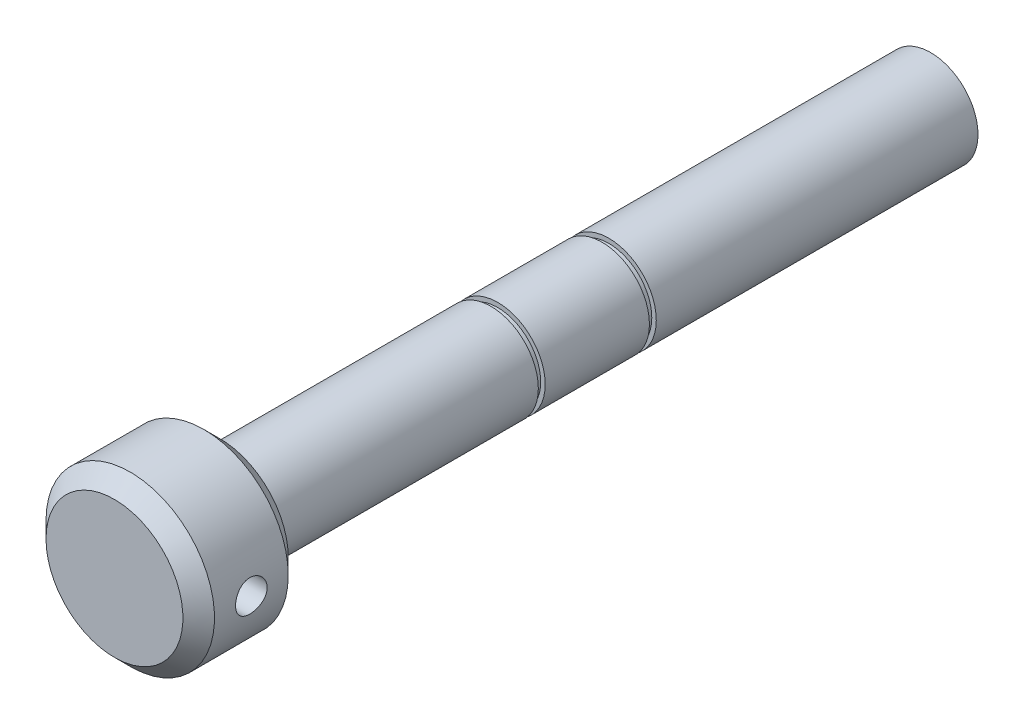
ISO-10303-21;
HEADER;
FILE_DESCRIPTION(('STEP AP214'),'2;1');
FILE_NAME('part.step','',(''),(''),'','','');
FILE_SCHEMA(('AUTOMOTIVE_DESIGN { 1 0 10303 214 1 1 1 1 }'));
ENDSEC;
DATA;
#1=APPLICATION_CONTEXT('core data for automotive mechanical design processes');
#2=APPLICATION_PROTOCOL_DEFINITION('international standard','automotive_design',2000,#1);
#3=PRODUCT_CONTEXT('',#1,'mechanical');
#4=PRODUCT('Part','Part','',(#3));
#5=PRODUCT_RELATED_PRODUCT_CATEGORY('part','',(#4));
#6=PRODUCT_DEFINITION_FORMATION('','',#4);
#7=PRODUCT_DEFINITION_CONTEXT('part definition',#1,'design');
#8=PRODUCT_DEFINITION('design','',#6,#7);
#9=PRODUCT_DEFINITION_SHAPE('','',#8);
#10=(LENGTH_UNIT() NAMED_UNIT(*) SI_UNIT(.MILLI.,.METRE.));
#11=(NAMED_UNIT(*) PLANE_ANGLE_UNIT() SI_UNIT($,.RADIAN.));
#12=(NAMED_UNIT(*) SI_UNIT($,.STERADIAN.) SOLID_ANGLE_UNIT());
#13=UNCERTAINTY_MEASURE_WITH_UNIT(LENGTH_MEASURE(1.E-05),#10,'distance_accuracy_value','');
#14=(GEOMETRIC_REPRESENTATION_CONTEXT(3) GLOBAL_UNCERTAINTY_ASSIGNED_CONTEXT((#13)) GLOBAL_UNIT_ASSIGNED_CONTEXT((#10,
#11,#12)) REPRESENTATION_CONTEXT('',''));
#15=CARTESIAN_POINT('',(0.,0.,0.));
#16=DIRECTION('',(0.,0.,1.));
#17=DIRECTION('',(1.,0.,0.));
#18=AXIS2_PLACEMENT_3D('',#15,#16,#17);
#19=CARTESIAN_POINT('',(0.,0.,-135.));
#20=DIRECTION('',(0.,0.,1.));
#21=DIRECTION('',(1.,0.,0.));
#22=AXIS2_PLACEMENT_3D('',#19,#20,#21);
#23=CYLINDRICAL_SURFACE('',#22,9.);
#24=CARTESIAN_POINT('',(0.,0.,0.));
#25=DIRECTION('',(0.,0.,1.));
#26=DIRECTION('',(1.,0.,0.));
#27=AXIS2_PLACEMENT_3D('',#24,#25,#26);
#28=CIRCLE('',#27,9.);
#29=CARTESIAN_POINT('',(9.,0.,0.));
#30=VERTEX_POINT('',#29);
#31=EDGE_CURVE('E149',#30,#30,#28,.T.);
#32=ORIENTED_EDGE('',*,*,#31,.F.);
#33=EDGE_LOOP('',(#32));
#34=FACE_BOUND('',#33,.T.);
#35=CARTESIAN_POINT('',(0.,0.,-51.5));
#36=DIRECTION('',(0.,0.,1.));
#37=DIRECTION('',(1.,0.,0.));
#38=AXIS2_PLACEMENT_3D('',#35,#36,#37);
#39=CIRCLE('',#38,9.);
#40=CARTESIAN_POINT('',(9.,0.,-51.5));
#41=VERTEX_POINT('',#40);
#42=EDGE_CURVE('E135',#41,#41,#39,.T.);
#43=ORIENTED_EDGE('',*,*,#42,.T.);
#44=EDGE_LOOP('',(#43));
#45=FACE_BOUND('',#44,.T.);
#46=ADVANCED_FACE('F43',(#34,#45),#23,.T.);
#47=CARTESIAN_POINT('',(0.,0.,20.));
#48=DIRECTION('',(0.,0.,-1.));
#49=DIRECTION('',(-1.,0.,0.));
#50=AXIS2_PLACEMENT_3D('',#47,#48,#49);
#51=CYLINDRICAL_SURFACE('',#50,16.);
#52=CARTESIAN_POINT('',(-16.,0.,7.));
#53=CARTESIAN_POINT('',(-15.999996976677,0.166943492930942,7.00000637917655));
#54=CARTESIAN_POINT('',(-15.9973601984343,0.333969985460197,7.01398215323876));
#55=CARTESIAN_POINT('',(-15.9870957178104,0.663316259683595,7.06947999023669));
#56=CARTESIAN_POINT('',(-15.9794638033379,0.825631948304451,7.11102530127947));
#57=CARTESIAN_POINT('',(-15.9600627753092,1.1407459237036,7.22034540251868));
#58=CARTESIAN_POINT('',(-15.9482973989297,1.29355266137069,7.28809650490509));
#59=CARTESIAN_POINT('',(-15.9219142119957,1.58561594618801,7.44783775384563));
#60=CARTESIAN_POINT('',(-15.9072966323658,1.72487358895465,7.53982593828964));
#61=CARTESIAN_POINT('',(-15.8766267286101,1.98756743186101,7.74659953600735));
#62=CARTESIAN_POINT('',(-15.860560697127,2.11081791006366,7.86161888934027));
#63=CARTESIAN_POINT('',(-15.828906369173,2.33639212270739,8.11068661817512));
#64=CARTESIAN_POINT('',(-15.8133181070905,2.43871435378483,8.24473635953857));
#65=CARTESIAN_POINT('',(-15.7842510249001,2.62029997331586,8.52937217672794));
#66=CARTESIAN_POINT('',(-15.7707898777236,2.69937443939211,8.68008074063447));
#67=CARTESIAN_POINT('',(-15.7476942642397,2.83101048664566,8.99293783035358));
#68=CARTESIAN_POINT('',(-15.7380594679392,2.88357435426196,9.15508536822243));
#69=CARTESIAN_POINT('',(-15.723845391491,2.96010107007,9.48423046182882));
#70=CARTESIAN_POINT('',(-15.7192089073281,2.98438780384078,9.65115019440693));
#71=CARTESIAN_POINT('',(-15.7153439430552,3.00467616190693,9.98675476961649));
#72=CARTESIAN_POINT('',(-15.7161149779752,3.00068032270748,10.1554394526046));
#73=CARTESIAN_POINT('',(-15.7229258540351,2.96477959204725,10.4874390505321));
#74=CARTESIAN_POINT('',(-15.7288961629467,2.9332429999209,10.6507954286003));
#75=CARTESIAN_POINT('',(-15.7453236656933,2.84373598792414,10.9698568395652));
#76=CARTESIAN_POINT('',(-15.7557810501903,2.78576444478999,11.1255615470186));
#77=CARTESIAN_POINT('',(-15.7800771058518,2.644672943586,11.4259773580005));
#78=CARTESIAN_POINT('',(-15.7939356764673,2.56140427064912,11.5706169411616));
#79=CARTESIAN_POINT('',(-15.8234594320584,2.37218737860832,11.8440094570805));
#80=CARTESIAN_POINT('',(-15.8391248003104,2.26623685778532,11.9727607754296));
#81=CARTESIAN_POINT('',(-15.8708000254433,2.03267811370595,12.2128499113449));
#82=CARTESIAN_POINT('',(-15.8868114204806,1.90475487372136,12.3238813049035));
#83=CARTESIAN_POINT('',(-15.9171477221664,1.63193607419765,12.5229544813508));
#84=CARTESIAN_POINT('',(-15.9314726119049,1.48704034451154,12.6109960337408));
#85=CARTESIAN_POINT('',(-15.9568507935502,1.18406997774933,12.76163550774));
#86=CARTESIAN_POINT('',(-15.9678999827258,1.02597912889299,12.8242015582358));
#87=CARTESIAN_POINT('',(-15.9854501080544,0.701278230797391,12.9218041861843));
#88=CARTESIAN_POINT('',(-15.9919515273599,0.534669088555573,12.9568436880907));
#89=CARTESIAN_POINT('',(-15.9996072128396,0.200297305806769,12.9979720620365));
#90=CARTESIAN_POINT('',(-16.0008390182456,0.0325880252682697,13.0044807830595));
#91=CARTESIAN_POINT('',(-15.9980308719646,-0.301522496184369,12.9894890409047));
#92=CARTESIAN_POINT('',(-15.9939911792886,-0.467923800960771,12.9679899538695));
#93=CARTESIAN_POINT('',(-15.9811422300081,-0.793363146436435,12.8979419296333));
#94=CARTESIAN_POINT('',(-15.9723704474806,-0.952448522092127,12.8496054349244));
#95=CARTESIAN_POINT('',(-15.95103684425,-1.26025726364927,12.7274845864424));
#96=CARTESIAN_POINT('',(-15.9384747662267,-1.40897992519021,12.6536985048684));
#97=CARTESIAN_POINT('',(-15.9107606071533,-1.69363334302643,12.481843743681));
#98=CARTESIAN_POINT('',(-15.8955817234913,-1.82940655403024,12.3835185229263));
#99=CARTESIAN_POINT('',(-15.8643868697942,-2.08267664652909,12.1657237252753));
#100=CARTESIAN_POINT('',(-15.8483708216937,-2.20017181952173,12.0462521739973));
#101=CARTESIAN_POINT('',(-15.817049513949,-2.41514591744096,11.7876553621771));
#102=CARTESIAN_POINT('',(-15.8017565172051,-2.51233832437153,11.6482901837492));
#103=CARTESIAN_POINT('',(-15.7738597115706,-2.68193350115574,11.3549647509525));
#104=CARTESIAN_POINT('',(-15.761255802747,-2.75433719227848,11.2010050392591));
#105=CARTESIAN_POINT('',(-15.7402604841915,-2.87189347025646,10.8835882655149));
#106=CARTESIAN_POINT('',(-15.7318488087376,-2.91717737589572,10.7201812408813));
#107=CARTESIAN_POINT('',(-15.7201440760483,-2.97961358652471,10.3879055549572));
#108=CARTESIAN_POINT('',(-15.7168504413158,-2.99676906541416,10.2190375120592));
#109=CARTESIAN_POINT('',(-15.7157839960771,-3.00235524296709,9.88350333711697));
#110=CARTESIAN_POINT('',(-15.7179243194859,-2.99123790006998,9.71684483808601));
#111=CARTESIAN_POINT('',(-15.7272920132,-2.94158350757606,9.38781715590942));
#112=CARTESIAN_POINT('',(-15.7345193531149,-2.90304662178664,9.22544794714512));
#113=CARTESIAN_POINT('',(-15.7532101604636,-2.79983775166526,8.90985103040904));
#114=CARTESIAN_POINT('',(-15.7646656918993,-2.73521470794505,8.75660681730846));
#115=CARTESIAN_POINT('',(-15.7905277510368,-2.58171737824408,8.46306349151831));
#116=CARTESIAN_POINT('',(-15.8049344872024,-2.49284137896371,8.32276529431043));
#117=CARTESIAN_POINT('',(-15.8353453221549,-2.2917897467907,8.05683263991541));
#118=CARTESIAN_POINT('',(-15.8513701070609,-2.17928519728607,7.93144917486579));
#119=CARTESIAN_POINT('',(-15.8830566783747,-1.93485585348458,7.70118967507095));
#120=CARTESIAN_POINT('',(-15.8987183805466,-1.80292660378323,7.59631835803973));
#121=CARTESIAN_POINT('',(-15.928079519361,-1.52196989014374,7.40917809474588));
#122=CARTESIAN_POINT('',(-15.9417600198112,-1.37279918128103,7.32712114301872));
#123=CARTESIAN_POINT('',(-15.9654323876137,-1.06258022730767,7.18936472678973));
#124=CARTESIAN_POINT('',(-15.9754277175807,-0.901543303410496,7.13364050590618));
#125=CARTESIAN_POINT('',(-15.9885658141526,-0.616694405650307,7.06144537116265));
#126=CARTESIAN_POINT('',(-15.9928294175641,-0.49454762050374,7.0384427393744));
#127=CARTESIAN_POINT('',(-15.9985475990802,-0.248282494230315,7.00771787576711));
#128=CARTESIAN_POINT('',(-16.0000022485961,-0.124164203305418,6.99999525548819));
#129=CARTESIAN_POINT('',(-16.,0.,7.));
#130=B_SPLINE_CURVE_WITH_KNOTS('',3,(#52,#53,#54,#55,#56,#57,#58,#59,#60,#61,#62,#63,#64,#65,
#66,#67,#68,#69,#70,#71,#72,#73,#74,#75,#76,#77,#78,#79,#80,#81,#82,#83,#84,#85,#86,#87,#88,#89,
#90,#91,#92,#93,#94,#95,#96,#97,#98,#99,#100,#101,#102,#103,#104,#105,#106,#107,#108,#109,#110,
#111,#112,#113,#114,#115,#116,#117,#118,#119,#120,#121,#122,#123,#124,#125,#126,#127,#128,#129),
.UNSPECIFIED.,.T.,.F.,(4,2,2,2,2,2,2,2,2,2,2,2,2,2,2,2,2,2,2,2,2,2,2,2,2,2,2,2,2,2,2,2,2,2,2,2,
2,2,4),(0.,0.500376401929848,1.0011752850709,1.50152254246181,2.00182930673781,2.50750236027261,
3.01321172567233,3.52292381008715,4.03259192623897,4.53636302890671,5.04008895174512,
5.53718001225531,6.03429219693573,6.53438525259061,7.03452908099719,7.54255536928154,
8.05058675089896,8.55925176643398,9.06786273347491,9.56896348152194,10.0700396092917,
10.5672046781566,11.0644035067606,11.5670355603542,12.069714568262,12.579068739746,
13.0884039790989,13.5952525563712,14.1020439389303,14.600785044635,15.0995231708301,
15.5973299241539,16.0951718531085,16.6004673993276,17.1058790252451,17.6158409783263,
18.1253225386235,18.4974868904882,18.8696417807908),.UNSPECIFIED.);
#131=CARTESIAN_POINT('',(-16.,0.,7.));
#132=VERTEX_POINT('',#131);
#133=EDGE_CURVE('E10',#132,#132,#130,.T.);
#134=ORIENTED_EDGE('',*,*,#133,.T.);
#135=EDGE_LOOP('',(#134));
#136=FACE_BOUND('',#135,.T.);
#137=CARTESIAN_POINT('',(16.,0.,7.));
#138=CARTESIAN_POINT('',(15.999996976677,-0.166943492930942,7.00000637917655));
#139=CARTESIAN_POINT('',(15.9973601984343,-0.333969985460197,7.01398215323876));
#140=CARTESIAN_POINT('',(15.9870957178104,-0.663316259683595,7.06947999023669));
#141=CARTESIAN_POINT('',(15.9794638033379,-0.825631948304451,7.11102530127947));
#142=CARTESIAN_POINT('',(15.9600627753092,-1.1407459237036,7.22034540251868));
#143=CARTESIAN_POINT('',(15.9482973989297,-1.29355266137069,7.28809650490509));
#144=CARTESIAN_POINT('',(15.9219142119957,-1.58561594618801,7.44783775384563));
#145=CARTESIAN_POINT('',(15.9072966323658,-1.72487358895465,7.53982593828964));
#146=CARTESIAN_POINT('',(15.8766267286101,-1.98756743186101,7.74659953600735));
#147=CARTESIAN_POINT('',(15.860560697127,-2.11081791006366,7.86161888934027));
#148=CARTESIAN_POINT('',(15.828906369173,-2.33639212270739,8.11068661817512));
#149=CARTESIAN_POINT('',(15.8133181070905,-2.43871435378483,8.24473635953857));
#150=CARTESIAN_POINT('',(15.7842510249001,-2.62029997331586,8.52937217672794));
#151=CARTESIAN_POINT('',(15.7707898777236,-2.69937443939211,8.68008074063447));
#152=CARTESIAN_POINT('',(15.7476942642397,-2.83101048664566,8.99293783035358));
#153=CARTESIAN_POINT('',(15.7380594679392,-2.88357435426196,9.15508536822243));
#154=CARTESIAN_POINT('',(15.723845391491,-2.96010107007,9.48423046182882));
#155=CARTESIAN_POINT('',(15.7192089073281,-2.98438780384078,9.65115019440693));
#156=CARTESIAN_POINT('',(15.7153439430552,-3.00467616190693,9.98675476961649));
#157=CARTESIAN_POINT('',(15.7161149779752,-3.00068032270748,10.1554394526046));
#158=CARTESIAN_POINT('',(15.7229258540351,-2.96477959204725,10.4874390505321));
#159=CARTESIAN_POINT('',(15.7288961629467,-2.9332429999209,10.6507954286003));
#160=CARTESIAN_POINT('',(15.7453236656933,-2.84373598792414,10.9698568395652));
#161=CARTESIAN_POINT('',(15.7557810501903,-2.78576444478999,11.1255615470186));
#162=CARTESIAN_POINT('',(15.7800771058518,-2.644672943586,11.4259773580005));
#163=CARTESIAN_POINT('',(15.7939356764673,-2.56140427064912,11.5706169411616));
#164=CARTESIAN_POINT('',(15.8234594320584,-2.37218737860832,11.8440094570805));
#165=CARTESIAN_POINT('',(15.8391248003104,-2.26623685778532,11.9727607754296));
#166=CARTESIAN_POINT('',(15.8708000254433,-2.03267811370595,12.2128499113449));
#167=CARTESIAN_POINT('',(15.8868114204806,-1.90475487372136,12.3238813049035));
#168=CARTESIAN_POINT('',(15.9171477221664,-1.63193607419765,12.5229544813508));
#169=CARTESIAN_POINT('',(15.9314726119049,-1.48704034451154,12.6109960337408));
#170=CARTESIAN_POINT('',(15.9568507935502,-1.18406997774933,12.76163550774));
#171=CARTESIAN_POINT('',(15.9678999827258,-1.02597912889299,12.8242015582358));
#172=CARTESIAN_POINT('',(15.9854501080544,-0.701278230797391,12.9218041861843));
#173=CARTESIAN_POINT('',(15.9919515273599,-0.534669088555573,12.9568436880907));
#174=CARTESIAN_POINT('',(15.9996072128396,-0.200297305806769,12.9979720620365));
#175=CARTESIAN_POINT('',(16.0008390182456,-0.0325880252682697,13.0044807830595));
#176=CARTESIAN_POINT('',(15.9980308719646,0.301522496184369,12.9894890409047));
#177=CARTESIAN_POINT('',(15.9939911792886,0.467923800960771,12.9679899538695));
#178=CARTESIAN_POINT('',(15.9811422300081,0.793363146436435,12.8979419296333));
#179=CARTESIAN_POINT('',(15.9723704474806,0.952448522092127,12.8496054349244));
#180=CARTESIAN_POINT('',(15.95103684425,1.26025726364927,12.7274845864424));
#181=CARTESIAN_POINT('',(15.9384747662267,1.40897992519021,12.6536985048684));
#182=CARTESIAN_POINT('',(15.9107606071533,1.69363334302643,12.481843743681));
#183=CARTESIAN_POINT('',(15.8955817234913,1.82940655403024,12.3835185229263));
#184=CARTESIAN_POINT('',(15.8643868697942,2.08267664652909,12.1657237252753));
#185=CARTESIAN_POINT('',(15.8483708216937,2.20017181952173,12.0462521739973));
#186=CARTESIAN_POINT('',(15.817049513949,2.41514591744096,11.7876553621771));
#187=CARTESIAN_POINT('',(15.8017565172051,2.51233832437153,11.6482901837492));
#188=CARTESIAN_POINT('',(15.7738597115706,2.68193350115574,11.3549647509525));
#189=CARTESIAN_POINT('',(15.761255802747,2.75433719227848,11.2010050392591));
#190=CARTESIAN_POINT('',(15.7402604841915,2.87189347025646,10.8835882655149));
#191=CARTESIAN_POINT('',(15.7318488087376,2.91717737589572,10.7201812408813));
#192=CARTESIAN_POINT('',(15.7201440760483,2.97961358652471,10.3879055549572));
#193=CARTESIAN_POINT('',(15.7168504413158,2.99676906541416,10.2190375120592));
#194=CARTESIAN_POINT('',(15.7157839960771,3.00235524296709,9.88350333711697));
#195=CARTESIAN_POINT('',(15.7179243194859,2.99123790006998,9.71684483808601));
#196=CARTESIAN_POINT('',(15.7272920132,2.94158350757606,9.38781715590942));
#197=CARTESIAN_POINT('',(15.7345193531149,2.90304662178664,9.22544794714512));
#198=CARTESIAN_POINT('',(15.7532101604636,2.79983775166526,8.90985103040904));
#199=CARTESIAN_POINT('',(15.7646656918993,2.73521470794505,8.75660681730846));
#200=CARTESIAN_POINT('',(15.7905277510368,2.58171737824408,8.46306349151831));
#201=CARTESIAN_POINT('',(15.8049344872024,2.49284137896371,8.32276529431043));
#202=CARTESIAN_POINT('',(15.8353453221549,2.2917897467907,8.05683263991541));
#203=CARTESIAN_POINT('',(15.8513701070609,2.17928519728607,7.93144917486579));
#204=CARTESIAN_POINT('',(15.8830566783747,1.93485585348458,7.70118967507095));
#205=CARTESIAN_POINT('',(15.8987183805466,1.80292660378323,7.59631835803973));
#206=CARTESIAN_POINT('',(15.928079519361,1.52196989014374,7.40917809474588));
#207=CARTESIAN_POINT('',(15.9417600198112,1.37279918128103,7.32712114301872));
#208=CARTESIAN_POINT('',(15.9654323876137,1.06258022730767,7.18936472678973));
#209=CARTESIAN_POINT('',(15.9754277175807,0.901543303410496,7.13364050590618));
#210=CARTESIAN_POINT('',(15.9885658141526,0.616694405650307,7.06144537116265));
#211=CARTESIAN_POINT('',(15.9928294175641,0.49454762050374,7.0384427393744));
#212=CARTESIAN_POINT('',(15.9985475990802,0.248282494230315,7.00771787576711));
#213=CARTESIAN_POINT('',(16.0000022485961,0.124164203305418,6.99999525548819));
#214=CARTESIAN_POINT('',(16.,0.,7.));
#215=B_SPLINE_CURVE_WITH_KNOTS('',3,(#137,#138,#139,#140,#141,#142,#143,#144,#145,#146,#147,
#148,#149,#150,#151,#152,#153,#154,#155,#156,#157,#158,#159,#160,#161,#162,#163,#164,#165,#166,
#167,#168,#169,#170,#171,#172,#173,#174,#175,#176,#177,#178,#179,#180,#181,#182,#183,#184,#185,
#186,#187,#188,#189,#190,#191,#192,#193,#194,#195,#196,#197,#198,#199,#200,#201,#202,#203,#204,
#205,#206,#207,#208,#209,#210,#211,#212,#213,#214),.UNSPECIFIED.,.T.,.F.,(4,2,2,2,2,2,2,2,2,2,2,
2,2,2,2,2,2,2,2,2,2,2,2,2,2,2,2,2,2,2,2,2,2,2,2,2,2,2,4),(0.,0.500376401929848,1.0011752850709,
1.50152254246181,2.00182930673781,2.50750236027261,3.01321172567233,3.52292381008715,
4.03259192623897,4.53636302890671,5.04008895174512,5.53718001225531,6.03429219693573,
6.53438525259061,7.03452908099719,7.54255536928154,8.05058675089896,8.55925176643398,
9.06786273347491,9.56896348152194,10.0700396092917,10.5672046781566,11.0644035067606,
11.5670355603542,12.069714568262,12.579068739746,13.0884039790989,13.5952525563712,
14.1020439389303,14.600785044635,15.0995231708301,15.5973299241539,16.0951718531085,
16.6004673993276,17.1058790252451,17.6158409783263,18.1253225386235,18.4974868904882,
18.8696417807908),.UNSPECIFIED.);
#216=CARTESIAN_POINT('',(16.,0.,7.));
#217=VERTEX_POINT('',#216);
#218=EDGE_CURVE('E57',#217,#217,#215,.T.);
#219=ORIENTED_EDGE('',*,*,#218,.T.);
#220=EDGE_LOOP('',(#219));
#221=FACE_BOUND('',#220,.T.);
#222=CARTESIAN_POINT('',(0.,0.,17.));
#223=DIRECTION('',(0.,0.,1.));
#224=DIRECTION('',(1.,0.,0.));
#225=AXIS2_PLACEMENT_3D('',#222,#223,#224);
#226=CIRCLE('',#225,16.);
#227=CARTESIAN_POINT('',(-16.,0.,17.));
#228=VERTEX_POINT('',#227);
#229=EDGE_CURVE('E67',#228,#228,#226,.F.);
#230=ORIENTED_EDGE('',*,*,#229,.T.);
#231=EDGE_LOOP('',(#230));
#232=FACE_BOUND('',#231,.T.);
#233=CARTESIAN_POINT('',(0.,0.,3.));
#234=DIRECTION('',(0.,0.,1.));
#235=DIRECTION('',(1.,0.,0.));
#236=AXIS2_PLACEMENT_3D('',#233,#234,#235);
#237=CIRCLE('',#236,16.);
#238=CARTESIAN_POINT('',(16.,0.,3.));
#239=VERTEX_POINT('',#238);
#240=EDGE_CURVE('E155',#239,#239,#237,.T.);
#241=ORIENTED_EDGE('',*,*,#240,.T.);
#242=EDGE_LOOP('',(#241));
#243=FACE_BOUND('',#242,.T.);
#244=ADVANCED_FACE('F73',(#136,#221,#232,#243),#51,.T.);
#245=CARTESIAN_POINT('',(0.,0.,20.));
#246=DIRECTION('',(0.,0.,1.));
#247=DIRECTION('',(1.,0.,0.));
#248=AXIS2_PLACEMENT_3D('',#245,#246,#247);
#249=PLANE('',#248);
#250=CARTESIAN_POINT('',(0.,0.,20.));
#251=DIRECTION('',(0.,0.,1.));
#252=DIRECTION('',(1.,0.,0.));
#253=AXIS2_PLACEMENT_3D('',#250,#251,#252);
#254=CIRCLE('',#253,13.);
#255=CARTESIAN_POINT('',(-13.,0.,20.));
#256=VERTEX_POINT('',#255);
#257=EDGE_CURVE('E148',#256,#256,#254,.T.);
#258=ORIENTED_EDGE('',*,*,#257,.T.);
#259=EDGE_LOOP('',(#258));
#260=FACE_BOUND('',#259,.T.);
#261=ADVANCED_FACE('F84',(#260),#249,.T.);
#262=CARTESIAN_POINT('',(0.,0.,0.));
#263=DIRECTION('',(0.,0.,1.));
#264=DIRECTION('',(1.,0.,0.));
#265=AXIS2_PLACEMENT_3D('',#262,#263,#264);
#266=PLANE('',#265);
#267=ORIENTED_EDGE('',*,*,#31,.T.);
#268=EDGE_LOOP('',(#267));
#269=FACE_BOUND('',#268,.T.);
#270=CARTESIAN_POINT('',(0.,0.,0.));
#271=DIRECTION('',(0.,0.,1.));
#272=DIRECTION('',(1.,0.,0.));
#273=AXIS2_PLACEMENT_3D('',#270,#271,#272);
#274=CIRCLE('',#273,13.);
#275=CARTESIAN_POINT('',(13.,0.,0.));
#276=VERTEX_POINT('',#275);
#277=EDGE_CURVE('E62',#276,#276,#274,.F.);
#278=ORIENTED_EDGE('',*,*,#277,.T.);
#279=EDGE_LOOP('',(#278));
#280=FACE_BOUND('',#279,.T.);
#281=ADVANCED_FACE('F87',(#269,#280),#266,.F.);
#282=CARTESIAN_POINT('',(0.,0.,20.));
#283=DIRECTION('',(0.,0.,-1.));
#284=DIRECTION('',(-1.,0.,0.));
#285=AXIS2_PLACEMENT_3D('',#282,#283,#284);
#286=CONICAL_SURFACE('',#285,13.,0.785398163397446);
#287=CARTESIAN_POINT('',(-16.,0.,17.));
#288=CARTESIAN_POINT('',(-15.96875,0.,17.03125));
#289=CARTESIAN_POINT('',(-15.9375,0.,17.0625));
#290=CARTESIAN_POINT('',(-15.875,0.,17.125));
#291=CARTESIAN_POINT('',(-15.84375,0.,17.15625));
#292=CARTESIAN_POINT('',(-15.78125,0.,17.21875));
#293=CARTESIAN_POINT('',(-15.75,0.,17.25));
#294=CARTESIAN_POINT('',(-15.6875,0.,17.3125));
#295=CARTESIAN_POINT('',(-15.65625,0.,17.34375));
#296=CARTESIAN_POINT('',(-15.59375,0.,17.40625));
#297=CARTESIAN_POINT('',(-15.5625,0.,17.4375));
#298=CARTESIAN_POINT('',(-15.5,0.,17.5));
#299=CARTESIAN_POINT('',(-15.46875,0.,17.53125));
#300=CARTESIAN_POINT('',(-15.40625,0.,17.59375));
#301=CARTESIAN_POINT('',(-15.375,0.,17.625));
#302=CARTESIAN_POINT('',(-15.3125,0.,17.6875));
#303=CARTESIAN_POINT('',(-15.28125,0.,17.71875));
#304=CARTESIAN_POINT('',(-15.21875,0.,17.78125));
#305=CARTESIAN_POINT('',(-15.1875,0.,17.8125));
#306=CARTESIAN_POINT('',(-15.125,0.,17.875));
#307=CARTESIAN_POINT('',(-15.09375,0.,17.90625));
#308=CARTESIAN_POINT('',(-15.03125,0.,17.96875));
#309=CARTESIAN_POINT('',(-15.,0.,18.));
#310=CARTESIAN_POINT('',(-14.9375,0.,18.0625));
#311=CARTESIAN_POINT('',(-14.90625,0.,18.09375));
#312=CARTESIAN_POINT('',(-14.84375,0.,18.15625));
#313=CARTESIAN_POINT('',(-14.8125,0.,18.1875));
#314=CARTESIAN_POINT('',(-14.75,0.,18.25));
#315=CARTESIAN_POINT('',(-14.71875,0.,18.28125));
#316=CARTESIAN_POINT('',(-14.65625,0.,18.34375));
#317=CARTESIAN_POINT('',(-14.625,0.,18.375));
#318=CARTESIAN_POINT('',(-14.5625,0.,18.4375));
#319=CARTESIAN_POINT('',(-14.53125,0.,18.46875));
#320=CARTESIAN_POINT('',(-14.46875,0.,18.53125));
#321=CARTESIAN_POINT('',(-14.4375,0.,18.5625));
#322=CARTESIAN_POINT('',(-14.375,0.,18.625));
#323=CARTESIAN_POINT('',(-14.34375,0.,18.65625));
#324=CARTESIAN_POINT('',(-14.28125,0.,18.71875));
#325=CARTESIAN_POINT('',(-14.25,0.,18.75));
#326=CARTESIAN_POINT('',(-14.1875,0.,18.8125));
#327=CARTESIAN_POINT('',(-14.15625,0.,18.84375));
#328=CARTESIAN_POINT('',(-14.09375,0.,18.90625));
#329=CARTESIAN_POINT('',(-14.0625,0.,18.9375));
#330=CARTESIAN_POINT('',(-14.,0.,19.));
#331=CARTESIAN_POINT('',(-13.96875,0.,19.03125));
#332=CARTESIAN_POINT('',(-13.90625,0.,19.09375));
#333=CARTESIAN_POINT('',(-13.875,0.,19.125));
#334=CARTESIAN_POINT('',(-13.8125,0.,19.1875));
#335=CARTESIAN_POINT('',(-13.78125,0.,19.21875));
#336=CARTESIAN_POINT('',(-13.71875,0.,19.28125));
#337=CARTESIAN_POINT('',(-13.6875,0.,19.3125));
#338=CARTESIAN_POINT('',(-13.625,0.,19.375));
#339=CARTESIAN_POINT('',(-13.59375,0.,19.40625));
#340=CARTESIAN_POINT('',(-13.53125,0.,19.46875));
#341=CARTESIAN_POINT('',(-13.5,0.,19.5));
#342=CARTESIAN_POINT('',(-13.4375,0.,19.5625));
#343=CARTESIAN_POINT('',(-13.40625,0.,19.59375));
#344=CARTESIAN_POINT('',(-13.34375,0.,19.65625));
#345=CARTESIAN_POINT('',(-13.3125,0.,19.6875));
#346=CARTESIAN_POINT('',(-13.25,0.,19.75));
#347=CARTESIAN_POINT('',(-13.21875,0.,19.78125));
#348=CARTESIAN_POINT('',(-13.15625,0.,19.84375));
#349=CARTESIAN_POINT('',(-13.125,0.,19.875));
#350=CARTESIAN_POINT('',(-13.0625,0.,19.9375));
#351=CARTESIAN_POINT('',(-13.03125,0.,19.96875));
#352=CARTESIAN_POINT('',(-13.,0.,20.));
#353=B_SPLINE_CURVE_WITH_KNOTS('',3,(#287,#288,#289,#290,#291,#292,#293,#294,#295,#296,#297,
#298,#299,#300,#301,#302,#303,#304,#305,#306,#307,#308,#309,#310,#311,#312,#313,#314,#315,#316,
#317,#318,#319,#320,#321,#322,#323,#324,#325,#326,#327,#328,#329,#330,#331,#332,#333,#334,#335,
#336,#337,#338,#339,#340,#341,#342,#343,#344,#345,#346,#347,#348,#349,#350,#351,#352),
.UNSPECIFIED.,.F.,.F.,(4,2,2,2,2,2,2,2,2,2,2,2,2,2,2,2,2,2,2,2,2,2,2,2,2,2,2,2,2,2,2,2,4),(0.,
0.13258252147248,0.265165042944958,0.397747564417436,0.530330085889913,0.662912607362394,
0.795495128834872,0.928077650307349,1.06066017177983,1.19324269325231,1.32582521472478,
1.45840773619726,1.59099025766974,1.72357277914222,1.8561553006147,1.98873782208718,
2.12132034355966,2.25390286503213,2.38648538650461,2.51906790797709,2.65165042944957,
2.78423295092205,2.91681547239453,3.049397993867,3.18198051533948,3.31456303681196,
3.44714555828444,3.57972807975692,3.71231060122939,3.84489312270187,3.97747564417435,
4.11005816564683,4.24264068711931),.UNSPECIFIED.);
#354=EDGE_CURVE('BSEAM90',#228,#256,#353,.T.);
#355=ORIENTED_EDGE('',*,*,#229,.F.);
#356=ORIENTED_EDGE('',*,*,#257,.F.);
#357=ORIENTED_EDGE('',*,*,#354,.T.);
#358=ORIENTED_EDGE('',*,*,#354,.F.);
#359=EDGE_LOOP('',(#355,#357,#356,#358));
#360=FACE_BOUND('',#359,.T.);
#361=ADVANCED_FACE('F90',(#360),#286,.T.);
#362=CARTESIAN_POINT('',(0.,0.,3.));
#363=DIRECTION('',(0.,0.,1.));
#364=DIRECTION('',(1.,0.,0.));
#365=AXIS2_PLACEMENT_3D('',#362,#363,#364);
#366=CONICAL_SURFACE('',#365,16.,0.78539816339745);
#367=ORIENTED_EDGE('',*,*,#277,.F.);
#368=EDGE_LOOP('',(#367));
#369=FACE_BOUND('',#368,.T.);
#370=ORIENTED_EDGE('',*,*,#240,.F.);
#371=EDGE_LOOP('',(#370));
#372=FACE_BOUND('',#371,.T.);
#373=ADVANCED_FACE('F46',(#369,#372),#366,.T.);
#374=CARTESIAN_POINT('',(-16.,0.,10.));
#375=DIRECTION('',(1.,0.,0.));
#376=DIRECTION('',(0.,0.,-1.));
#377=AXIS2_PLACEMENT_3D('',#374,#375,#376);
#378=CYLINDRICAL_SURFACE('',#377,3.);
#379=ORIENTED_EDGE('',*,*,#218,.F.);
#380=EDGE_LOOP('',(#379));
#381=FACE_BOUND('',#380,.T.);
#382=ORIENTED_EDGE('',*,*,#133,.F.);
#383=EDGE_LOOP('',(#382));
#384=FACE_BOUND('',#383,.T.);
#385=ADVANCED_FACE('F76',(#381,#384),#378,.F.);
#386=CARTESIAN_POINT('',(0.,9.,-51.5));
#387=DIRECTION('',(0.,0.,-1.));
#388=DIRECTION('',(-1.,0.,0.));
#389=AXIS2_PLACEMENT_3D('',#386,#387,#388);
#390=PLANE('',#389);
#391=CARTESIAN_POINT('',(0.,0.,-51.5));
#392=DIRECTION('',(0.,0.,1.));
#393=DIRECTION('',(1.,0.,0.));
#394=AXIS2_PLACEMENT_3D('',#391,#392,#393);
#395=CIRCLE('',#394,8.15);
#396=CARTESIAN_POINT('',(8.15,0.,-51.5));
#397=VERTEX_POINT('',#396);
#398=EDGE_CURVE('E299',#397,#397,#395,.T.);
#399=ORIENTED_EDGE('',*,*,#398,.T.);
#400=EDGE_LOOP('',(#399));
#401=FACE_BOUND('',#400,.T.);
#402=ORIENTED_EDGE('',*,*,#42,.F.);
#403=EDGE_LOOP('',(#402));
#404=FACE_BOUND('',#403,.T.);
#405=ADVANCED_FACE('F81',(#401,#404),#390,.T.);
#406=CARTESIAN_POINT('',(0.,0.,0.));
#407=DIRECTION('',(0.,0.,1.));
#408=DIRECTION('',(1.,0.,0.));
#409=AXIS2_PLACEMENT_3D('',#406,#407,#408);
#410=CYLINDRICAL_SURFACE('',#409,8.15);
#411=CARTESIAN_POINT('',(0.,0.,-52.8));
#412=DIRECTION('',(0.,0.,1.));
#413=DIRECTION('',(1.,0.,0.));
#414=AXIS2_PLACEMENT_3D('',#411,#412,#413);
#415=CIRCLE('',#414,8.15);
#416=CARTESIAN_POINT('',(8.15,0.,-52.8));
#417=VERTEX_POINT('',#416);
#418=EDGE_CURVE('E295',#417,#417,#415,.T.);
#419=ORIENTED_EDGE('',*,*,#418,.T.);
#420=EDGE_LOOP('',(#419));
#421=FACE_BOUND('',#420,.T.);
#422=ORIENTED_EDGE('',*,*,#398,.F.);
#423=EDGE_LOOP('',(#422));
#424=FACE_BOUND('',#423,.T.);
#425=ADVANCED_FACE('F185',(#421,#424),#410,.T.);
#426=CARTESIAN_POINT('',(0.,8.15,-52.8));
#427=DIRECTION('',(0.,0.,1.));
#428=DIRECTION('',(1.,0.,0.));
#429=AXIS2_PLACEMENT_3D('',#426,#427,#428);
#430=PLANE('',#429);
#431=CARTESIAN_POINT('',(0.,0.,-52.8));
#432=DIRECTION('',(0.,0.,1.));
#433=DIRECTION('',(1.,0.,0.));
#434=AXIS2_PLACEMENT_3D('',#431,#432,#433);
#435=CIRCLE('',#434,9.);
#436=CARTESIAN_POINT('',(9.,0.,-52.8));
#437=VERTEX_POINT('',#436);
#438=EDGE_CURVE('E145',#437,#437,#435,.T.);
#439=ORIENTED_EDGE('',*,*,#438,.T.);
#440=EDGE_LOOP('',(#439));
#441=FACE_BOUND('',#440,.T.);
#442=ORIENTED_EDGE('',*,*,#418,.F.);
#443=EDGE_LOOP('',(#442));
#444=FACE_BOUND('',#443,.T.);
#445=ADVANCED_FACE('F109',(#441,#444),#430,.T.);
#446=CARTESIAN_POINT('',(0.,0.,-72.6));
#447=DIRECTION('',(0.,0.,1.));
#448=DIRECTION('',(1.,0.,0.));
#449=AXIS2_PLACEMENT_3D('',#446,#447,#448);
#450=CIRCLE('',#449,9.);
#451=CARTESIAN_POINT('',(9.,0.,-72.6));
#452=VERTEX_POINT('',#451);
#453=EDGE_CURVE('E141',#452,#452,#450,.T.);
#454=ORIENTED_EDGE('',*,*,#453,.T.);
#455=EDGE_LOOP('',(#454));
#456=FACE_BOUND('',#455,.T.);
#457=ORIENTED_EDGE('',*,*,#438,.F.);
#458=EDGE_LOOP('',(#457));
#459=FACE_BOUND('',#458,.T.);
#460=ADVANCED_FACE('F100',(#456,#459),#23,.T.);
#461=CARTESIAN_POINT('',(0.,9.,-72.6));
#462=DIRECTION('',(0.,0.,-1.));
#463=DIRECTION('',(-1.,0.,0.));
#464=AXIS2_PLACEMENT_3D('',#461,#462,#463);
#465=PLANE('',#464);
#466=CARTESIAN_POINT('',(0.,0.,-72.6));
#467=DIRECTION('',(0.,0.,1.));
#468=DIRECTION('',(1.,0.,0.));
#469=AXIS2_PLACEMENT_3D('',#466,#467,#468);
#470=CIRCLE('',#469,8.15);
#471=CARTESIAN_POINT('',(8.15,0.,-72.6));
#472=VERTEX_POINT('',#471);
#473=EDGE_CURVE('E132',#472,#472,#470,.T.);
#474=ORIENTED_EDGE('',*,*,#473,.T.);
#475=EDGE_LOOP('',(#474));
#476=FACE_BOUND('',#475,.T.);
#477=ORIENTED_EDGE('',*,*,#453,.F.);
#478=EDGE_LOOP('',(#477));
#479=FACE_BOUND('',#478,.T.);
#480=ADVANCED_FACE('F108',(#476,#479),#465,.T.);
#481=CARTESIAN_POINT('',(0.,0.,0.));
#482=DIRECTION('',(0.,0.,1.));
#483=DIRECTION('',(1.,0.,0.));
#484=AXIS2_PLACEMENT_3D('',#481,#482,#483);
#485=CYLINDRICAL_SURFACE('',#484,8.15);
#486=CARTESIAN_POINT('',(0.,0.,-73.9));
#487=DIRECTION('',(0.,0.,1.));
#488=DIRECTION('',(1.,0.,0.));
#489=AXIS2_PLACEMENT_3D('',#486,#487,#488);
#490=CIRCLE('',#489,8.15);
#491=CARTESIAN_POINT('',(8.15,0.,-73.9));
#492=VERTEX_POINT('',#491);
#493=EDGE_CURVE('E128',#492,#492,#490,.T.);
#494=ORIENTED_EDGE('',*,*,#493,.T.);
#495=EDGE_LOOP('',(#494));
#496=FACE_BOUND('',#495,.T.);
#497=ORIENTED_EDGE('',*,*,#473,.F.);
#498=EDGE_LOOP('',(#497));
#499=FACE_BOUND('',#498,.T.);
#500=ADVANCED_FACE('F211',(#496,#499),#485,.T.);
#501=CARTESIAN_POINT('',(0.,8.15,-73.9));
#502=DIRECTION('',(0.,0.,1.));
#503=DIRECTION('',(1.,0.,0.));
#504=AXIS2_PLACEMENT_3D('',#501,#502,#503);
#505=PLANE('',#504);
#506=CARTESIAN_POINT('',(0.,0.,-73.9));
#507=DIRECTION('',(0.,0.,1.));
#508=DIRECTION('',(1.,0.,0.));
#509=AXIS2_PLACEMENT_3D('',#506,#507,#508);
#510=CIRCLE('',#509,9.);
#511=CARTESIAN_POINT('',(9.,0.,-73.9));
#512=VERTEX_POINT('',#511);
#513=EDGE_CURVE('E125',#512,#512,#510,.T.);
#514=ORIENTED_EDGE('',*,*,#513,.T.);
#515=EDGE_LOOP('',(#514));
#516=FACE_BOUND('',#515,.T.);
#517=ORIENTED_EDGE('',*,*,#493,.F.);
#518=EDGE_LOOP('',(#517));
#519=FACE_BOUND('',#518,.T.);
#520=ADVANCED_FACE('F117',(#516,#519),#505,.T.);
#521=CARTESIAN_POINT('',(0.,0.,-135.));
#522=DIRECTION('',(0.,0.,1.));
#523=DIRECTION('',(1.,0.,0.));
#524=AXIS2_PLACEMENT_3D('',#521,#522,#523);
#525=PLANE('',#524);
#526=CARTESIAN_POINT('',(0.,0.,-135.));
#527=DIRECTION('',(0.,0.,1.));
#528=DIRECTION('',(1.,0.,0.));
#529=AXIS2_PLACEMENT_3D('',#526,#527,#528);
#530=CIRCLE('',#529,9.);
#531=CARTESIAN_POINT('',(9.,0.,-135.));
#532=VERTEX_POINT('',#531);
#533=EDGE_CURVE('E122',#532,#532,#530,.T.);
#534=ORIENTED_EDGE('',*,*,#533,.F.);
#535=EDGE_LOOP('',(#534));
#536=FACE_BOUND('',#535,.T.);
#537=ADVANCED_FACE('F112',(#536),#525,.F.);
#538=ORIENTED_EDGE('',*,*,#533,.T.);
#539=EDGE_LOOP('',(#538));
#540=FACE_BOUND('',#539,.T.);
#541=ORIENTED_EDGE('',*,*,#513,.F.);
#542=EDGE_LOOP('',(#541));
#543=FACE_BOUND('',#542,.T.);
#544=ADVANCED_FACE('F101',(#540,#543),#23,.T.);
#545=CLOSED_SHELL('',(#46,#244,#261,#281,#361,#373,#385,#405,#425,#445,#460,#480,#500,#520,#537,#544));
#546=MANIFOLD_SOLID_BREP('B2',#545);
#547=ADVANCED_BREP_SHAPE_REPRESENTATION('',(#18,#546),#14);
#548=SHAPE_DEFINITION_REPRESENTATION(#9,#547);
ENDSEC;
END-ISO-10303-21;
